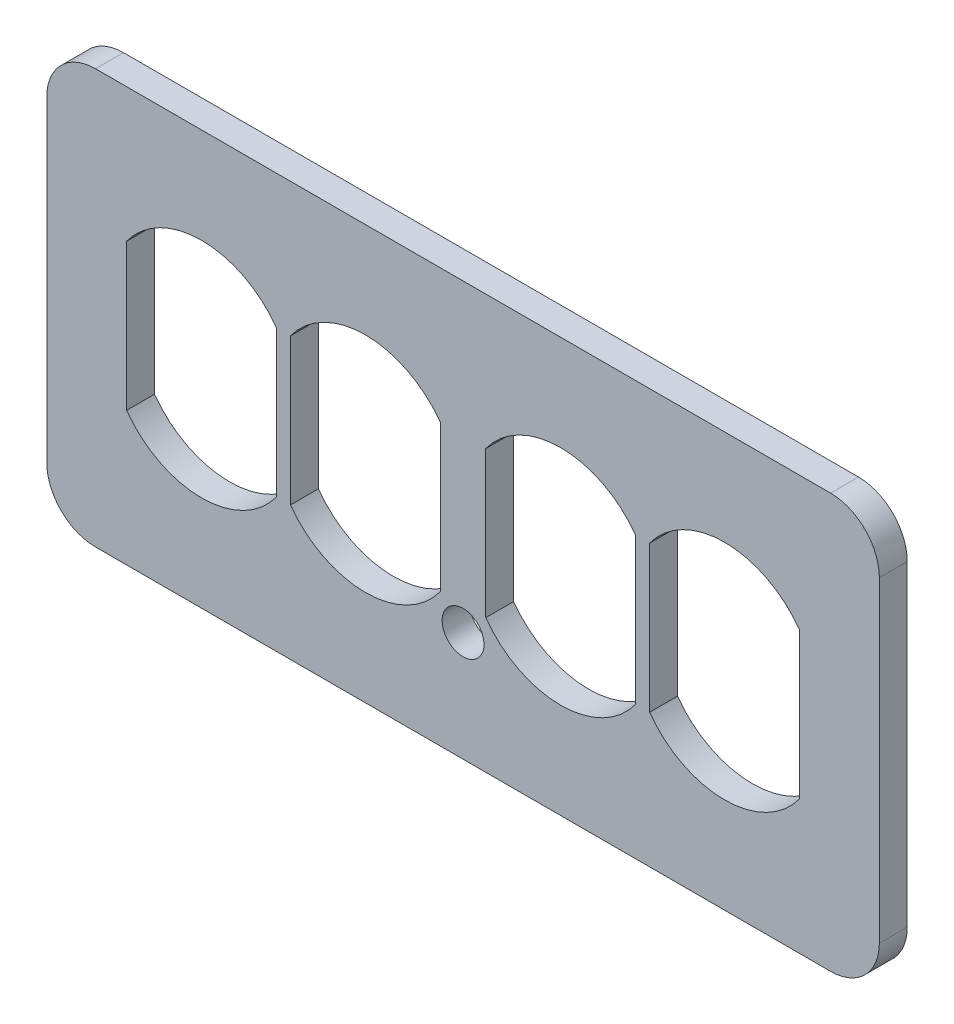
ISO-10303-21;
HEADER;
FILE_DESCRIPTION(('STEP AP214'),'2;1');
FILE_NAME('part.step','',(''),(''),'','','');
FILE_SCHEMA(('AUTOMOTIVE_DESIGN { 1 0 10303 214 1 1 1 1 }'));
ENDSEC;
DATA;
#1=APPLICATION_CONTEXT('core data for automotive mechanical design processes');
#2=APPLICATION_PROTOCOL_DEFINITION('international standard','automotive_design',2000,#1);
#3=PRODUCT_CONTEXT('',#1,'mechanical');
#4=PRODUCT('Part','Part','',(#3));
#5=PRODUCT_RELATED_PRODUCT_CATEGORY('part','',(#4));
#6=PRODUCT_DEFINITION_FORMATION('','',#4);
#7=PRODUCT_DEFINITION_CONTEXT('part definition',#1,'design');
#8=PRODUCT_DEFINITION('design','',#6,#7);
#9=PRODUCT_DEFINITION_SHAPE('','',#8);
#10=(LENGTH_UNIT() NAMED_UNIT(*) SI_UNIT(.MILLI.,.METRE.));
#11=(NAMED_UNIT(*) PLANE_ANGLE_UNIT() SI_UNIT($,.RADIAN.));
#12=(NAMED_UNIT(*) SI_UNIT($,.STERADIAN.) SOLID_ANGLE_UNIT());
#13=UNCERTAINTY_MEASURE_WITH_UNIT(LENGTH_MEASURE(1.E-05),#10,'distance_accuracy_value','');
#14=(GEOMETRIC_REPRESENTATION_CONTEXT(3) GLOBAL_UNCERTAINTY_ASSIGNED_CONTEXT((#13)) GLOBAL_UNIT_ASSIGNED_CONTEXT((#10,
#11,#12)) REPRESENTATION_CONTEXT('',''));
#15=CARTESIAN_POINT('',(0.,0.,0.));
#16=DIRECTION('',(0.,0.,1.));
#17=DIRECTION('',(1.,0.,0.));
#18=AXIS2_PLACEMENT_3D('',#15,#16,#17);
#19=CARTESIAN_POINT('',(0.,0.,4.));
#20=DIRECTION('',(0.,0.,1.));
#21=DIRECTION('',(1.,0.,0.));
#22=AXIS2_PLACEMENT_3D('',#19,#20,#21);
#23=PLANE('',#22);
#24=DIRECTION('',(0.,-1.,0.));
#25=VECTOR('',#24,1.);
#26=CARTESIAN_POINT('',(-24.75,10.5,4.));
#27=LINE('',#26,#25);
#28=CARTESIAN_POINT('',(-24.75,10.5,4.));
#29=VERTEX_POINT('',#28);
#30=CARTESIAN_POINT('',(-24.75,-10.5,4.));
#31=VERTEX_POINT('',#30);
#32=EDGE_CURVE('E210',#29,#31,#27,.T.);
#33=ORIENTED_EDGE('',*,*,#32,.F.);
#34=CARTESIAN_POINT('',(-14.,2.74431818181819,4.));
#35=DIRECTION('',(0.,0.,1.));
#36=DIRECTION('',(1.,0.,0.));
#37=AXIS2_PLACEMENT_3D('',#34,#35,#36);
#38=CIRCLE('',#37,13.2556818181818);
#39=CARTESIAN_POINT('',(-3.25,10.5,4.));
#40=VERTEX_POINT('',#39);
#41=EDGE_CURVE('E200',#40,#29,#38,.T.);
#42=ORIENTED_EDGE('',*,*,#41,.F.);
#43=DIRECTION('',(0.,1.,0.));
#44=VECTOR('',#43,1.);
#45=CARTESIAN_POINT('',(-3.25,10.5,4.));
#46=LINE('',#45,#44);
#47=CARTESIAN_POINT('',(-3.25000000000001,-10.5,4.));
#48=VERTEX_POINT('',#47);
#49=EDGE_CURVE('E226',#48,#40,#46,.T.);
#50=ORIENTED_EDGE('',*,*,#49,.F.);
#51=CARTESIAN_POINT('',(-14.,-2.74431818181819,4.));
#52=DIRECTION('',(0.,0.,1.));
#53=DIRECTION('',(-1.,0.,0.));
#54=AXIS2_PLACEMENT_3D('',#51,#52,#53);
#55=CIRCLE('',#54,13.2556818181818);
#56=EDGE_CURVE('E224',#31,#48,#55,.T.);
#57=ORIENTED_EDGE('',*,*,#56,.F.);
#58=EDGE_LOOP('',(#33,#42,#50,#57));
#59=FACE_BOUND('',#58,.T.);
#60=DIRECTION('',(0.,-1.,0.));
#61=VECTOR('',#60,1.);
#62=CARTESIAN_POINT('',(-48.25,10.5,4.));
#63=LINE('',#62,#61);
#64=CARTESIAN_POINT('',(-48.25,10.5,4.));
#65=VERTEX_POINT('',#64);
#66=CARTESIAN_POINT('',(-48.25,-10.5,4.));
#67=VERTEX_POINT('',#66);
#68=EDGE_CURVE('E246',#65,#67,#63,.T.);
#69=ORIENTED_EDGE('',*,*,#68,.F.);
#70=CARTESIAN_POINT('',(-37.5,2.74431818181819,4.));
#71=DIRECTION('',(0.,0.,1.));
#72=DIRECTION('',(1.,0.,0.));
#73=AXIS2_PLACEMENT_3D('',#70,#71,#72);
#74=CIRCLE('',#73,13.2556818181818);
#75=CARTESIAN_POINT('',(-26.75,10.5,4.));
#76=VERTEX_POINT('',#75);
#77=EDGE_CURVE('E244',#76,#65,#74,.T.);
#78=ORIENTED_EDGE('',*,*,#77,.F.);
#79=DIRECTION('',(0.,1.,0.));
#80=VECTOR('',#79,1.);
#81=CARTESIAN_POINT('',(-26.75,10.5,4.));
#82=LINE('',#81,#80);
#83=CARTESIAN_POINT('',(-26.75,-10.5,4.));
#84=VERTEX_POINT('',#83);
#85=EDGE_CURVE('E252',#84,#76,#82,.T.);
#86=ORIENTED_EDGE('',*,*,#85,.F.);
#87=CARTESIAN_POINT('',(-37.5,-2.74431818181819,4.));
#88=DIRECTION('',(0.,0.,1.));
#89=DIRECTION('',(-1.,0.,0.));
#90=AXIS2_PLACEMENT_3D('',#87,#88,#89);
#91=CIRCLE('',#90,13.2556818181818);
#92=EDGE_CURVE('E249',#67,#84,#91,.T.);
#93=ORIENTED_EDGE('',*,*,#92,.F.);
#94=EDGE_LOOP('',(#69,#78,#86,#93));
#95=FACE_BOUND('',#94,.T.);
#96=DIRECTION('',(0.,1.,0.));
#97=VECTOR('',#96,1.);
#98=CARTESIAN_POINT('',(48.25,10.5,4.));
#99=LINE('',#98,#97);
#100=CARTESIAN_POINT('',(48.25,-10.5,4.));
#101=VERTEX_POINT('',#100);
#102=CARTESIAN_POINT('',(48.25,10.5,4.));
#103=VERTEX_POINT('',#102);
#104=EDGE_CURVE('E277',#101,#103,#99,.T.);
#105=ORIENTED_EDGE('',*,*,#104,.F.);
#106=CARTESIAN_POINT('',(37.5,-2.74431818181819,4.));
#107=DIRECTION('',(0.,0.,1.));
#108=DIRECTION('',(1.,0.,0.));
#109=AXIS2_PLACEMENT_3D('',#106,#107,#108);
#110=CIRCLE('',#109,13.2556818181818);
#111=CARTESIAN_POINT('',(26.75,-10.5,4.));
#112=VERTEX_POINT('',#111);
#113=EDGE_CURVE('E275',#112,#101,#110,.T.);
#114=ORIENTED_EDGE('',*,*,#113,.F.);
#115=DIRECTION('',(0.,-1.,0.));
#116=VECTOR('',#115,1.);
#117=CARTESIAN_POINT('',(26.75,10.5,4.));
#118=LINE('',#117,#116);
#119=CARTESIAN_POINT('',(26.75,10.5,4.));
#120=VERTEX_POINT('',#119);
#121=EDGE_CURVE('E283',#120,#112,#118,.T.);
#122=ORIENTED_EDGE('',*,*,#121,.F.);
#123=CARTESIAN_POINT('',(37.5,2.74431818181819,4.));
#124=DIRECTION('',(0.,0.,1.));
#125=DIRECTION('',(-1.,0.,0.));
#126=AXIS2_PLACEMENT_3D('',#123,#124,#125);
#127=CIRCLE('',#126,13.2556818181818);
#128=EDGE_CURVE('E280',#103,#120,#127,.T.);
#129=ORIENTED_EDGE('',*,*,#128,.F.);
#130=EDGE_LOOP('',(#105,#114,#122,#129));
#131=FACE_BOUND('',#130,.T.);
#132=DIRECTION('',(0.,1.,0.));
#133=VECTOR('',#132,1.);
#134=CARTESIAN_POINT('',(24.75,10.5,4.));
#135=LINE('',#134,#133);
#136=CARTESIAN_POINT('',(24.75,-10.5,4.));
#137=VERTEX_POINT('',#136);
#138=CARTESIAN_POINT('',(24.75,10.5,4.));
#139=VERTEX_POINT('',#138);
#140=EDGE_CURVE('E308',#137,#139,#135,.T.);
#141=ORIENTED_EDGE('',*,*,#140,.F.);
#142=CARTESIAN_POINT('',(14.,-2.74431818181819,4.));
#143=DIRECTION('',(0.,0.,1.));
#144=DIRECTION('',(1.,0.,0.));
#145=AXIS2_PLACEMENT_3D('',#142,#143,#144);
#146=CIRCLE('',#145,13.2556818181818);
#147=CARTESIAN_POINT('',(3.25000000000001,-10.5,4.));
#148=VERTEX_POINT('',#147);
#149=EDGE_CURVE('E306',#148,#137,#146,.T.);
#150=ORIENTED_EDGE('',*,*,#149,.F.);
#151=DIRECTION('',(0.,-1.,0.));
#152=VECTOR('',#151,1.);
#153=CARTESIAN_POINT('',(3.25,10.5,4.));
#154=LINE('',#153,#152);
#155=CARTESIAN_POINT('',(3.25,10.5,4.));
#156=VERTEX_POINT('',#155);
#157=EDGE_CURVE('E314',#156,#148,#154,.T.);
#158=ORIENTED_EDGE('',*,*,#157,.F.);
#159=CARTESIAN_POINT('',(14.,2.74431818181819,4.));
#160=DIRECTION('',(0.,0.,1.));
#161=DIRECTION('',(-1.,0.,0.));
#162=AXIS2_PLACEMENT_3D('',#159,#160,#161);
#163=CIRCLE('',#162,13.2556818181818);
#164=EDGE_CURVE('E311',#139,#156,#163,.T.);
#165=ORIENTED_EDGE('',*,*,#164,.F.);
#166=EDGE_LOOP('',(#141,#150,#158,#165));
#167=FACE_BOUND('',#166,.T.);
#168=DIRECTION('',(0.,-1.,0.));
#169=VECTOR('',#168,1.);
#170=CARTESIAN_POINT('',(-59.7,29.7,4.));
#171=LINE('',#170,#169);
#172=CARTESIAN_POINT('',(-59.7,22.7,4.));
#173=VERTEX_POINT('',#172);
#174=CARTESIAN_POINT('',(-59.7,-22.7,4.));
#175=VERTEX_POINT('',#174);
#176=EDGE_CURVE('E342',#173,#175,#171,.T.);
#177=ORIENTED_EDGE('',*,*,#176,.T.);
#178=CARTESIAN_POINT('',(-52.7,-22.7,4.));
#179=DIRECTION('',(0.,0.,1.));
#180=DIRECTION('',(1.,0.,0.));
#181=AXIS2_PLACEMENT_3D('',#178,#179,#180);
#182=CIRCLE('',#181,7.);
#183=CARTESIAN_POINT('',(-52.7,-29.7,4.));
#184=VERTEX_POINT('',#183);
#185=EDGE_CURVE('E380',#175,#184,#182,.T.);
#186=ORIENTED_EDGE('',*,*,#185,.T.);
#187=DIRECTION('',(1.,0.,0.));
#188=VECTOR('',#187,1.);
#189=CARTESIAN_POINT('',(-59.7,-29.7,4.));
#190=LINE('',#189,#188);
#191=CARTESIAN_POINT('',(52.7,-29.7,4.));
#192=VERTEX_POINT('',#191);
#193=EDGE_CURVE('E345',#184,#192,#190,.T.);
#194=ORIENTED_EDGE('',*,*,#193,.T.);
#195=CARTESIAN_POINT('',(52.7,-22.7,4.));
#196=DIRECTION('',(0.,0.,1.));
#197=DIRECTION('',(1.,0.,0.));
#198=AXIS2_PLACEMENT_3D('',#195,#196,#197);
#199=CIRCLE('',#198,7.);
#200=CARTESIAN_POINT('',(59.7,-22.7,4.));
#201=VERTEX_POINT('',#200);
#202=EDGE_CURVE('E375',#192,#201,#199,.T.);
#203=ORIENTED_EDGE('',*,*,#202,.T.);
#204=DIRECTION('',(0.,1.,0.));
#205=VECTOR('',#204,1.);
#206=CARTESIAN_POINT('',(59.7,29.7,4.));
#207=LINE('',#206,#205);
#208=CARTESIAN_POINT('',(59.7,22.7,4.));
#209=VERTEX_POINT('',#208);
#210=EDGE_CURVE('E337',#201,#209,#207,.T.);
#211=ORIENTED_EDGE('',*,*,#210,.T.);
#212=CARTESIAN_POINT('',(52.7,22.7,4.));
#213=DIRECTION('',(0.,0.,1.));
#214=DIRECTION('',(1.,0.,0.));
#215=AXIS2_PLACEMENT_3D('',#212,#213,#214);
#216=CIRCLE('',#215,7.);
#217=CARTESIAN_POINT('',(52.7,29.7,4.));
#218=VERTEX_POINT('',#217);
#219=EDGE_CURVE('E59',#209,#218,#216,.T.);
#220=ORIENTED_EDGE('',*,*,#219,.T.);
#221=DIRECTION('',(-1.,0.,0.));
#222=VECTOR('',#221,1.);
#223=CARTESIAN_POINT('',(-59.7,29.7,4.));
#224=LINE('',#223,#222);
#225=CARTESIAN_POINT('',(-52.7,29.7,4.));
#226=VERTEX_POINT('',#225);
#227=EDGE_CURVE('E339',#218,#226,#224,.T.);
#228=ORIENTED_EDGE('',*,*,#227,.T.);
#229=CARTESIAN_POINT('',(-52.7,22.7,4.));
#230=DIRECTION('',(0.,0.,1.));
#231=DIRECTION('',(1.,0.,0.));
#232=AXIS2_PLACEMENT_3D('',#229,#230,#231);
#233=CIRCLE('',#232,7.);
#234=EDGE_CURVE('E378',#226,#173,#233,.T.);
#235=ORIENTED_EDGE('',*,*,#234,.T.);
#236=EDGE_LOOP('',(#177,#186,#194,#203,#211,#220,#228,#235));
#237=FACE_BOUND('',#236,.T.);
#238=CARTESIAN_POINT('',(0.,-13.9722154800521,4.));
#239=DIRECTION('',(0.,0.,1.));
#240=DIRECTION('',(1.,0.,0.));
#241=AXIS2_PLACEMENT_3D('',#238,#239,#240);
#242=CIRCLE('',#241,3.);
#243=CARTESIAN_POINT('',(3.,-13.9722154800521,4.));
#244=VERTEX_POINT('',#243);
#245=EDGE_CURVE('E233',#244,#244,#242,.T.);
#246=ORIENTED_EDGE('',*,*,#245,.F.);
#247=EDGE_LOOP('',(#246));
#248=FACE_BOUND('',#247,.T.);
#249=ADVANCED_FACE('F37',(#59,#95,#131,#167,#237,#248),#23,.T.);
#250=CARTESIAN_POINT('',(0.,0.,0.));
#251=DIRECTION('',(0.,0.,1.));
#252=DIRECTION('',(1.,0.,0.));
#253=AXIS2_PLACEMENT_3D('',#250,#251,#252);
#254=PLANE('',#253);
#255=CARTESIAN_POINT('',(-37.5,2.74431818181819,0.));
#256=DIRECTION('',(0.,0.,1.));
#257=DIRECTION('',(1.,0.,0.));
#258=AXIS2_PLACEMENT_3D('',#255,#256,#257);
#259=CIRCLE('',#258,13.2556818181818);
#260=CARTESIAN_POINT('',(-26.75,10.5,0.));
#261=VERTEX_POINT('',#260);
#262=CARTESIAN_POINT('',(-48.25,10.5,0.));
#263=VERTEX_POINT('',#262);
#264=EDGE_CURVE('E218',#261,#263,#259,.T.);
#265=ORIENTED_EDGE('',*,*,#264,.T.);
#266=DIRECTION('',(0.,-1.,0.));
#267=VECTOR('',#266,1.);
#268=CARTESIAN_POINT('',(-48.25,10.5,0.));
#269=LINE('',#268,#267);
#270=CARTESIAN_POINT('',(-48.25,-10.5,0.));
#271=VERTEX_POINT('',#270);
#272=EDGE_CURVE('E257',#263,#271,#269,.T.);
#273=ORIENTED_EDGE('',*,*,#272,.T.);
#274=CARTESIAN_POINT('',(-37.5,-2.74431818181819,0.));
#275=DIRECTION('',(0.,0.,1.));
#276=DIRECTION('',(-1.,0.,0.));
#277=AXIS2_PLACEMENT_3D('',#274,#275,#276);
#278=CIRCLE('',#277,13.2556818181818);
#279=CARTESIAN_POINT('',(-26.75,-10.5,0.));
#280=VERTEX_POINT('',#279);
#281=EDGE_CURVE('E260',#271,#280,#278,.T.);
#282=ORIENTED_EDGE('',*,*,#281,.T.);
#283=DIRECTION('',(0.,1.,0.));
#284=VECTOR('',#283,1.);
#285=CARTESIAN_POINT('',(-26.75,10.5,0.));
#286=LINE('',#285,#284);
#287=EDGE_CURVE('E247',#280,#261,#286,.T.);
#288=ORIENTED_EDGE('',*,*,#287,.T.);
#289=EDGE_LOOP('',(#265,#273,#282,#288));
#290=FACE_BOUND('',#289,.T.);
#291=CARTESIAN_POINT('',(14.,-2.74431818181819,0.));
#292=DIRECTION('',(0.,0.,1.));
#293=DIRECTION('',(1.,0.,0.));
#294=AXIS2_PLACEMENT_3D('',#291,#292,#293);
#295=CIRCLE('',#294,13.2556818181818);
#296=CARTESIAN_POINT('',(3.25000000000001,-10.5,0.));
#297=VERTEX_POINT('',#296);
#298=CARTESIAN_POINT('',(24.75,-10.5,0.));
#299=VERTEX_POINT('',#298);
#300=EDGE_CURVE('E305',#297,#299,#295,.T.);
#301=ORIENTED_EDGE('',*,*,#300,.T.);
#302=DIRECTION('',(0.,1.,0.));
#303=VECTOR('',#302,1.);
#304=CARTESIAN_POINT('',(24.75,10.5,0.));
#305=LINE('',#304,#303);
#306=CARTESIAN_POINT('',(24.75,10.5,0.));
#307=VERTEX_POINT('',#306);
#308=EDGE_CURVE('E319',#299,#307,#305,.T.);
#309=ORIENTED_EDGE('',*,*,#308,.T.);
#310=CARTESIAN_POINT('',(14.,2.74431818181819,0.));
#311=DIRECTION('',(0.,0.,1.));
#312=DIRECTION('',(-1.,0.,0.));
#313=AXIS2_PLACEMENT_3D('',#310,#311,#312);
#314=CIRCLE('',#313,13.2556818181818);
#315=CARTESIAN_POINT('',(3.25,10.5,0.));
#316=VERTEX_POINT('',#315);
#317=EDGE_CURVE('E322',#307,#316,#314,.T.);
#318=ORIENTED_EDGE('',*,*,#317,.T.);
#319=DIRECTION('',(0.,-1.,0.));
#320=VECTOR('',#319,1.);
#321=CARTESIAN_POINT('',(3.25,10.5,0.));
#322=LINE('',#321,#320);
#323=EDGE_CURVE('E309',#316,#297,#322,.T.);
#324=ORIENTED_EDGE('',*,*,#323,.T.);
#325=EDGE_LOOP('',(#301,#309,#318,#324));
#326=FACE_BOUND('',#325,.T.);
#327=DIRECTION('',(1.,0.,0.));
#328=VECTOR('',#327,1.);
#329=CARTESIAN_POINT('',(-59.7,-29.7,0.));
#330=LINE('',#329,#328);
#331=CARTESIAN_POINT('',(-52.7,-29.7,0.));
#332=VERTEX_POINT('',#331);
#333=CARTESIAN_POINT('',(52.7,-29.7,0.));
#334=VERTEX_POINT('',#333);
#335=EDGE_CURVE('E340',#332,#334,#330,.T.);
#336=ORIENTED_EDGE('',*,*,#335,.F.);
#337=CARTESIAN_POINT('',(-52.7,-22.7,0.));
#338=DIRECTION('',(0.,0.,1.));
#339=DIRECTION('',(1.,0.,0.));
#340=AXIS2_PLACEMENT_3D('',#337,#338,#339);
#341=CIRCLE('',#340,7.);
#342=CARTESIAN_POINT('',(-59.7,-22.7,0.));
#343=VERTEX_POINT('',#342);
#344=EDGE_CURVE('E368',#332,#343,#341,.F.);
#345=ORIENTED_EDGE('',*,*,#344,.T.);
#346=DIRECTION('',(0.,-1.,0.));
#347=VECTOR('',#346,1.);
#348=CARTESIAN_POINT('',(-59.7,29.7,0.));
#349=LINE('',#348,#347);
#350=CARTESIAN_POINT('',(-59.7,22.7,0.));
#351=VERTEX_POINT('',#350);
#352=EDGE_CURVE('E353',#351,#343,#349,.T.);
#353=ORIENTED_EDGE('',*,*,#352,.F.);
#354=CARTESIAN_POINT('',(-52.7,22.7,0.));
#355=DIRECTION('',(0.,0.,1.));
#356=DIRECTION('',(1.,0.,0.));
#357=AXIS2_PLACEMENT_3D('',#354,#355,#356);
#358=CIRCLE('',#357,7.);
#359=CARTESIAN_POINT('',(-52.7,29.7,0.));
#360=VERTEX_POINT('',#359);
#361=EDGE_CURVE('E366',#351,#360,#358,.F.);
#362=ORIENTED_EDGE('',*,*,#361,.T.);
#363=DIRECTION('',(-1.,0.,0.));
#364=VECTOR('',#363,1.);
#365=CARTESIAN_POINT('',(-59.7,29.7,0.));
#366=LINE('',#365,#364);
#367=CARTESIAN_POINT('',(52.7,29.7,0.));
#368=VERTEX_POINT('',#367);
#369=EDGE_CURVE('E351',#368,#360,#366,.T.);
#370=ORIENTED_EDGE('',*,*,#369,.F.);
#371=CARTESIAN_POINT('',(52.7,22.7,0.));
#372=DIRECTION('',(0.,0.,1.));
#373=DIRECTION('',(1.,0.,0.));
#374=AXIS2_PLACEMENT_3D('',#371,#372,#373);
#375=CIRCLE('',#374,7.);
#376=CARTESIAN_POINT('',(59.7,22.7,0.));
#377=VERTEX_POINT('',#376);
#378=EDGE_CURVE('E364',#368,#377,#375,.F.);
#379=ORIENTED_EDGE('',*,*,#378,.T.);
#380=DIRECTION('',(0.,1.,0.));
#381=VECTOR('',#380,1.);
#382=CARTESIAN_POINT('',(59.7,29.7,0.));
#383=LINE('',#382,#381);
#384=CARTESIAN_POINT('',(59.7,-22.7,0.));
#385=VERTEX_POINT('',#384);
#386=EDGE_CURVE('E336',#385,#377,#383,.T.);
#387=ORIENTED_EDGE('',*,*,#386,.F.);
#388=CARTESIAN_POINT('',(52.7,-22.7,0.));
#389=DIRECTION('',(0.,0.,1.));
#390=DIRECTION('',(1.,0.,0.));
#391=AXIS2_PLACEMENT_3D('',#388,#389,#390);
#392=CIRCLE('',#391,7.);
#393=EDGE_CURVE('E362',#385,#334,#392,.F.);
#394=ORIENTED_EDGE('',*,*,#393,.T.);
#395=EDGE_LOOP('',(#336,#345,#353,#362,#370,#379,#387,#394));
#396=FACE_BOUND('',#395,.T.);
#397=CARTESIAN_POINT('',(37.5,-2.74431818181819,0.));
#398=DIRECTION('',(0.,0.,1.));
#399=DIRECTION('',(1.,0.,0.));
#400=AXIS2_PLACEMENT_3D('',#397,#398,#399);
#401=CIRCLE('',#400,13.2556818181818);
#402=CARTESIAN_POINT('',(26.75,-10.5,0.));
#403=VERTEX_POINT('',#402);
#404=CARTESIAN_POINT('',(48.25,-10.5,0.));
#405=VERTEX_POINT('',#404);
#406=EDGE_CURVE('E274',#403,#405,#401,.T.);
#407=ORIENTED_EDGE('',*,*,#406,.T.);
#408=DIRECTION('',(0.,1.,0.));
#409=VECTOR('',#408,1.);
#410=CARTESIAN_POINT('',(48.25,10.5,0.));
#411=LINE('',#410,#409);
#412=CARTESIAN_POINT('',(48.25,10.5,0.));
#413=VERTEX_POINT('',#412);
#414=EDGE_CURVE('E288',#405,#413,#411,.T.);
#415=ORIENTED_EDGE('',*,*,#414,.T.);
#416=CARTESIAN_POINT('',(37.5,2.74431818181819,0.));
#417=DIRECTION('',(0.,0.,1.));
#418=DIRECTION('',(-1.,0.,0.));
#419=AXIS2_PLACEMENT_3D('',#416,#417,#418);
#420=CIRCLE('',#419,13.2556818181818);
#421=CARTESIAN_POINT('',(26.75,10.5,0.));
#422=VERTEX_POINT('',#421);
#423=EDGE_CURVE('E291',#413,#422,#420,.T.);
#424=ORIENTED_EDGE('',*,*,#423,.T.);
#425=DIRECTION('',(0.,-1.,0.));
#426=VECTOR('',#425,1.);
#427=CARTESIAN_POINT('',(26.75,10.5,0.));
#428=LINE('',#427,#426);
#429=EDGE_CURVE('E278',#422,#403,#428,.T.);
#430=ORIENTED_EDGE('',*,*,#429,.T.);
#431=EDGE_LOOP('',(#407,#415,#424,#430));
#432=FACE_BOUND('',#431,.T.);
#433=CARTESIAN_POINT('',(-14.,2.74431818181819,0.));
#434=DIRECTION('',(0.,0.,1.));
#435=DIRECTION('',(1.,0.,0.));
#436=AXIS2_PLACEMENT_3D('',#433,#434,#435);
#437=CIRCLE('',#436,13.2556818181818);
#438=CARTESIAN_POINT('',(-3.25,10.5,0.));
#439=VERTEX_POINT('',#438);
#440=CARTESIAN_POINT('',(-24.75,10.5,0.));
#441=VERTEX_POINT('',#440);
#442=EDGE_CURVE('E231',#439,#441,#437,.T.);
#443=ORIENTED_EDGE('',*,*,#442,.T.);
#444=DIRECTION('',(0.,-1.,0.));
#445=VECTOR('',#444,1.);
#446=CARTESIAN_POINT('',(-24.75,10.5,0.));
#447=LINE('',#446,#445);
#448=CARTESIAN_POINT('',(-24.75,-10.5,0.));
#449=VERTEX_POINT('',#448);
#450=EDGE_CURVE('E217',#441,#449,#447,.T.);
#451=ORIENTED_EDGE('',*,*,#450,.T.);
#452=CARTESIAN_POINT('',(-14.,-2.74431818181819,0.));
#453=DIRECTION('',(0.,0.,1.));
#454=DIRECTION('',(-1.,0.,0.));
#455=AXIS2_PLACEMENT_3D('',#452,#453,#454);
#456=CIRCLE('',#455,13.2556818181818);
#457=CARTESIAN_POINT('',(-3.25000000000001,-10.5,0.));
#458=VERTEX_POINT('',#457);
#459=EDGE_CURVE('E235',#449,#458,#456,.T.);
#460=ORIENTED_EDGE('',*,*,#459,.T.);
#461=DIRECTION('',(0.,1.,0.));
#462=VECTOR('',#461,1.);
#463=CARTESIAN_POINT('',(-3.25,10.5,0.));
#464=LINE('',#463,#462);
#465=EDGE_CURVE('E211',#458,#439,#464,.T.);
#466=ORIENTED_EDGE('',*,*,#465,.T.);
#467=EDGE_LOOP('',(#443,#451,#460,#466));
#468=FACE_BOUND('',#467,.T.);
#469=CARTESIAN_POINT('',(0.,-13.9722154800521,0.));
#470=DIRECTION('',(0.,0.,1.));
#471=DIRECTION('',(1.,0.,0.));
#472=AXIS2_PLACEMENT_3D('',#469,#470,#471);
#473=CIRCLE('',#472,3.);
#474=CARTESIAN_POINT('',(3.,-13.9722154800521,0.));
#475=VERTEX_POINT('',#474);
#476=EDGE_CURVE('E691',#475,#475,#473,.T.);
#477=ORIENTED_EDGE('',*,*,#476,.T.);
#478=EDGE_LOOP('',(#477));
#479=FACE_BOUND('',#478,.T.);
#480=ADVANCED_FACE('F396',(#290,#326,#396,#432,#468,#479),#254,.F.);
#481=CARTESIAN_POINT('',(59.7,29.7,4.));
#482=DIRECTION('',(-1.,0.,0.));
#483=DIRECTION('',(0.,0.,1.));
#484=AXIS2_PLACEMENT_3D('',#481,#482,#483);
#485=PLANE('',#484);
#486=ORIENTED_EDGE('',*,*,#386,.T.);
#487=DIRECTION('',(0.,0.,-1.));
#488=VECTOR('',#487,1.);
#489=CARTESIAN_POINT('',(59.7,22.7,4.));
#490=LINE('',#489,#488);
#491=EDGE_CURVE('E11',#377,#209,#490,.F.);
#492=ORIENTED_EDGE('',*,*,#491,.T.);
#493=ORIENTED_EDGE('',*,*,#210,.F.);
#494=DIRECTION('',(0.,0.,-1.));
#495=VECTOR('',#494,1.);
#496=CARTESIAN_POINT('',(59.7,-22.7,4.));
#497=LINE('',#496,#495);
#498=EDGE_CURVE('E45',#201,#385,#497,.T.);
#499=ORIENTED_EDGE('',*,*,#498,.T.);
#500=EDGE_LOOP('',(#486,#492,#493,#499));
#501=FACE_BOUND('',#500,.T.);
#502=ADVANCED_FACE('F390',(#501),#485,.F.);
#503=CARTESIAN_POINT('',(-59.7,29.7,4.));
#504=DIRECTION('',(0.,-1.,0.));
#505=DIRECTION('',(0.,0.,-1.));
#506=AXIS2_PLACEMENT_3D('',#503,#504,#505);
#507=PLANE('',#506);
#508=ORIENTED_EDGE('',*,*,#369,.T.);
#509=DIRECTION('',(0.,0.,-1.));
#510=VECTOR('',#509,1.);
#511=CARTESIAN_POINT('',(-52.7,29.7,4.));
#512=LINE('',#511,#510);
#513=EDGE_CURVE('E52',#360,#226,#512,.F.);
#514=ORIENTED_EDGE('',*,*,#513,.T.);
#515=ORIENTED_EDGE('',*,*,#227,.F.);
#516=DIRECTION('',(0.,0.,-1.));
#517=VECTOR('',#516,1.);
#518=CARTESIAN_POINT('',(52.7,29.7,4.));
#519=LINE('',#518,#517);
#520=EDGE_CURVE('E382',#218,#368,#519,.T.);
#521=ORIENTED_EDGE('',*,*,#520,.T.);
#522=EDGE_LOOP('',(#508,#514,#515,#521));
#523=FACE_BOUND('',#522,.T.);
#524=ADVANCED_FACE('F402',(#523),#507,.F.);
#525=CARTESIAN_POINT('',(-59.7,29.7,4.));
#526=DIRECTION('',(1.,0.,0.));
#527=DIRECTION('',(0.,0.,-1.));
#528=AXIS2_PLACEMENT_3D('',#525,#526,#527);
#529=PLANE('',#528);
#530=ORIENTED_EDGE('',*,*,#352,.T.);
#531=DIRECTION('',(0.,0.,-1.));
#532=VECTOR('',#531,1.);
#533=CARTESIAN_POINT('',(-59.7,-22.7,4.));
#534=LINE('',#533,#532);
#535=EDGE_CURVE('E373',#343,#175,#534,.F.);
#536=ORIENTED_EDGE('',*,*,#535,.T.);
#537=ORIENTED_EDGE('',*,*,#176,.F.);
#538=DIRECTION('',(0.,0.,-1.));
#539=VECTOR('',#538,1.);
#540=CARTESIAN_POINT('',(-59.7,22.7,4.));
#541=LINE('',#540,#539);
#542=EDGE_CURVE('E370',#173,#351,#541,.T.);
#543=ORIENTED_EDGE('',*,*,#542,.T.);
#544=EDGE_LOOP('',(#530,#536,#537,#543));
#545=FACE_BOUND('',#544,.T.);
#546=ADVANCED_FACE('F411',(#545),#529,.F.);
#547=CARTESIAN_POINT('',(-59.7,-29.7,4.));
#548=DIRECTION('',(0.,1.,0.));
#549=DIRECTION('',(0.,0.,1.));
#550=AXIS2_PLACEMENT_3D('',#547,#548,#549);
#551=PLANE('',#550);
#552=ORIENTED_EDGE('',*,*,#193,.F.);
#553=DIRECTION('',(0.,0.,-1.));
#554=VECTOR('',#553,1.);
#555=CARTESIAN_POINT('',(-52.7,-29.7,4.));
#556=LINE('',#555,#554);
#557=EDGE_CURVE('E359',#184,#332,#556,.T.);
#558=ORIENTED_EDGE('',*,*,#557,.T.);
#559=ORIENTED_EDGE('',*,*,#335,.T.);
#560=DIRECTION('',(0.,0.,-1.));
#561=VECTOR('',#560,1.);
#562=CARTESIAN_POINT('',(52.7,-29.7,4.));
#563=LINE('',#562,#561);
#564=EDGE_CURVE('E348',#334,#192,#563,.F.);
#565=ORIENTED_EDGE('',*,*,#564,.T.);
#566=EDGE_LOOP('',(#552,#558,#559,#565));
#567=FACE_BOUND('',#566,.T.);
#568=ADVANCED_FACE('F419',(#567),#551,.F.);
#569=CARTESIAN_POINT('',(14.,-2.74431818181819,4.));
#570=DIRECTION('',(0.,0.,-1.));
#571=DIRECTION('',(-1.,0.,0.));
#572=AXIS2_PLACEMENT_3D('',#569,#570,#571);
#573=CYLINDRICAL_SURFACE('',#572,13.2556818181818);
#574=ORIENTED_EDGE('',*,*,#300,.F.);
#575=DIRECTION('',(0.,0.,-1.));
#576=VECTOR('',#575,1.);
#577=CARTESIAN_POINT('',(3.25000000000001,-10.5,4.));
#578=LINE('',#577,#576);
#579=EDGE_CURVE('E316',#148,#297,#578,.T.);
#580=ORIENTED_EDGE('',*,*,#579,.F.);
#581=ORIENTED_EDGE('',*,*,#149,.T.);
#582=DIRECTION('',(0.,0.,-1.));
#583=VECTOR('',#582,1.);
#584=CARTESIAN_POINT('',(24.75,-10.5,4.));
#585=LINE('',#584,#583);
#586=EDGE_CURVE('E333',#137,#299,#585,.T.);
#587=ORIENTED_EDGE('',*,*,#586,.T.);
#588=EDGE_LOOP('',(#574,#580,#581,#587));
#589=FACE_BOUND('',#588,.T.);
#590=ADVANCED_FACE('F433',(#589),#573,.F.);
#591=CARTESIAN_POINT('',(24.75,10.5,4.));
#592=DIRECTION('',(-1.,0.,0.));
#593=DIRECTION('',(0.,0.,1.));
#594=AXIS2_PLACEMENT_3D('',#591,#592,#593);
#595=PLANE('',#594);
#596=ORIENTED_EDGE('',*,*,#308,.F.);
#597=ORIENTED_EDGE('',*,*,#586,.F.);
#598=ORIENTED_EDGE('',*,*,#140,.T.);
#599=DIRECTION('',(0.,0.,-1.));
#600=VECTOR('',#599,1.);
#601=CARTESIAN_POINT('',(24.75,10.5,4.));
#602=LINE('',#601,#600);
#603=EDGE_CURVE('E331',#139,#307,#602,.T.);
#604=ORIENTED_EDGE('',*,*,#603,.T.);
#605=EDGE_LOOP('',(#596,#597,#598,#604));
#606=FACE_BOUND('',#605,.T.);
#607=ADVANCED_FACE('F599',(#606),#595,.T.);
#608=CARTESIAN_POINT('',(14.,2.74431818181819,4.));
#609=DIRECTION('',(0.,0.,-1.));
#610=DIRECTION('',(-1.,0.,0.));
#611=AXIS2_PLACEMENT_3D('',#608,#609,#610);
#612=CYLINDRICAL_SURFACE('',#611,13.2556818181818);
#613=ORIENTED_EDGE('',*,*,#317,.F.);
#614=ORIENTED_EDGE('',*,*,#603,.F.);
#615=ORIENTED_EDGE('',*,*,#164,.T.);
#616=DIRECTION('',(0.,0.,-1.));
#617=VECTOR('',#616,1.);
#618=CARTESIAN_POINT('',(3.25,10.5,4.));
#619=LINE('',#618,#617);
#620=EDGE_CURVE('E329',#156,#316,#619,.T.);
#621=ORIENTED_EDGE('',*,*,#620,.T.);
#622=EDGE_LOOP('',(#613,#614,#615,#621));
#623=FACE_BOUND('',#622,.T.);
#624=ADVANCED_FACE('F590',(#623),#612,.F.);
#625=CARTESIAN_POINT('',(3.25,10.5,4.));
#626=DIRECTION('',(1.,0.,0.));
#627=DIRECTION('',(0.,1.,0.));
#628=AXIS2_PLACEMENT_3D('',#625,#626,#627);
#629=PLANE('',#628);
#630=ORIENTED_EDGE('',*,*,#323,.F.);
#631=ORIENTED_EDGE('',*,*,#620,.F.);
#632=ORIENTED_EDGE('',*,*,#157,.T.);
#633=ORIENTED_EDGE('',*,*,#579,.T.);
#634=EDGE_LOOP('',(#630,#631,#632,#633));
#635=FACE_BOUND('',#634,.T.);
#636=ADVANCED_FACE('F581',(#635),#629,.T.);
#637=CARTESIAN_POINT('',(37.5,-2.74431818181819,4.));
#638=DIRECTION('',(0.,0.,-1.));
#639=DIRECTION('',(-1.,0.,0.));
#640=AXIS2_PLACEMENT_3D('',#637,#638,#639);
#641=CYLINDRICAL_SURFACE('',#640,13.2556818181818);
#642=ORIENTED_EDGE('',*,*,#406,.F.);
#643=DIRECTION('',(0.,0.,-1.));
#644=VECTOR('',#643,1.);
#645=CARTESIAN_POINT('',(26.75,-10.5,4.));
#646=LINE('',#645,#644);
#647=EDGE_CURVE('E285',#112,#403,#646,.T.);
#648=ORIENTED_EDGE('',*,*,#647,.F.);
#649=ORIENTED_EDGE('',*,*,#113,.T.);
#650=DIRECTION('',(0.,0.,-1.));
#651=VECTOR('',#650,1.);
#652=CARTESIAN_POINT('',(48.25,-10.5,4.));
#653=LINE('',#652,#651);
#654=EDGE_CURVE('E302',#101,#405,#653,.T.);
#655=ORIENTED_EDGE('',*,*,#654,.T.);
#656=EDGE_LOOP('',(#642,#648,#649,#655));
#657=FACE_BOUND('',#656,.T.);
#658=ADVANCED_FACE('F572',(#657),#641,.F.);
#659=CARTESIAN_POINT('',(48.25,10.5,4.));
#660=DIRECTION('',(-1.,0.,0.));
#661=DIRECTION('',(0.,0.,1.));
#662=AXIS2_PLACEMENT_3D('',#659,#660,#661);
#663=PLANE('',#662);
#664=ORIENTED_EDGE('',*,*,#414,.F.);
#665=ORIENTED_EDGE('',*,*,#654,.F.);
#666=ORIENTED_EDGE('',*,*,#104,.T.);
#667=DIRECTION('',(0.,0.,-1.));
#668=VECTOR('',#667,1.);
#669=CARTESIAN_POINT('',(48.25,10.5,4.));
#670=LINE('',#669,#668);
#671=EDGE_CURVE('E300',#103,#413,#670,.T.);
#672=ORIENTED_EDGE('',*,*,#671,.T.);
#673=EDGE_LOOP('',(#664,#665,#666,#672));
#674=FACE_BOUND('',#673,.T.);
#675=ADVANCED_FACE('F563',(#674),#663,.T.);
#676=CARTESIAN_POINT('',(37.5,2.74431818181819,4.));
#677=DIRECTION('',(0.,0.,-1.));
#678=DIRECTION('',(-1.,0.,0.));
#679=AXIS2_PLACEMENT_3D('',#676,#677,#678);
#680=CYLINDRICAL_SURFACE('',#679,13.2556818181818);
#681=ORIENTED_EDGE('',*,*,#423,.F.);
#682=ORIENTED_EDGE('',*,*,#671,.F.);
#683=ORIENTED_EDGE('',*,*,#128,.T.);
#684=DIRECTION('',(0.,0.,-1.));
#685=VECTOR('',#684,1.);
#686=CARTESIAN_POINT('',(26.75,10.5,4.));
#687=LINE('',#686,#685);
#688=EDGE_CURVE('E298',#120,#422,#687,.T.);
#689=ORIENTED_EDGE('',*,*,#688,.T.);
#690=EDGE_LOOP('',(#681,#682,#683,#689));
#691=FACE_BOUND('',#690,.T.);
#692=ADVANCED_FACE('F554',(#691),#680,.F.);
#693=CARTESIAN_POINT('',(26.75,10.5,4.));
#694=DIRECTION('',(1.,0.,0.));
#695=DIRECTION('',(0.,1.,0.));
#696=AXIS2_PLACEMENT_3D('',#693,#694,#695);
#697=PLANE('',#696);
#698=ORIENTED_EDGE('',*,*,#429,.F.);
#699=ORIENTED_EDGE('',*,*,#688,.F.);
#700=ORIENTED_EDGE('',*,*,#121,.T.);
#701=ORIENTED_EDGE('',*,*,#647,.T.);
#702=EDGE_LOOP('',(#698,#699,#700,#701));
#703=FACE_BOUND('',#702,.T.);
#704=ADVANCED_FACE('F545',(#703),#697,.T.);
#705=CARTESIAN_POINT('',(-37.5,2.74431818181819,4.));
#706=DIRECTION('',(0.,0.,-1.));
#707=DIRECTION('',(-1.,0.,0.));
#708=AXIS2_PLACEMENT_3D('',#705,#706,#707);
#709=CYLINDRICAL_SURFACE('',#708,13.2556818181818);
#710=ORIENTED_EDGE('',*,*,#264,.F.);
#711=DIRECTION('',(0.,0.,-1.));
#712=VECTOR('',#711,1.);
#713=CARTESIAN_POINT('',(-26.75,10.5,4.));
#714=LINE('',#713,#712);
#715=EDGE_CURVE('E254',#76,#261,#714,.T.);
#716=ORIENTED_EDGE('',*,*,#715,.F.);
#717=ORIENTED_EDGE('',*,*,#77,.T.);
#718=DIRECTION('',(0.,0.,-1.));
#719=VECTOR('',#718,1.);
#720=CARTESIAN_POINT('',(-48.25,10.5,4.));
#721=LINE('',#720,#719);
#722=EDGE_CURVE('E271',#65,#263,#721,.T.);
#723=ORIENTED_EDGE('',*,*,#722,.T.);
#724=EDGE_LOOP('',(#710,#716,#717,#723));
#725=FACE_BOUND('',#724,.T.);
#726=ADVANCED_FACE('F536',(#725),#709,.F.);
#727=CARTESIAN_POINT('',(-48.25,10.5,4.));
#728=DIRECTION('',(1.,0.,0.));
#729=DIRECTION('',(0.,0.,-1.));
#730=AXIS2_PLACEMENT_3D('',#727,#728,#729);
#731=PLANE('',#730);
#732=ORIENTED_EDGE('',*,*,#272,.F.);
#733=ORIENTED_EDGE('',*,*,#722,.F.);
#734=ORIENTED_EDGE('',*,*,#68,.T.);
#735=DIRECTION('',(0.,0.,-1.));
#736=VECTOR('',#735,1.);
#737=CARTESIAN_POINT('',(-48.25,-10.5,4.));
#738=LINE('',#737,#736);
#739=EDGE_CURVE('E269',#67,#271,#738,.T.);
#740=ORIENTED_EDGE('',*,*,#739,.T.);
#741=EDGE_LOOP('',(#732,#733,#734,#740));
#742=FACE_BOUND('',#741,.T.);
#743=ADVANCED_FACE('F527',(#742),#731,.T.);
#744=CARTESIAN_POINT('',(-37.5,-2.74431818181819,4.));
#745=DIRECTION('',(0.,0.,-1.));
#746=DIRECTION('',(-1.,0.,0.));
#747=AXIS2_PLACEMENT_3D('',#744,#745,#746);
#748=CYLINDRICAL_SURFACE('',#747,13.2556818181818);
#749=ORIENTED_EDGE('',*,*,#281,.F.);
#750=ORIENTED_EDGE('',*,*,#739,.F.);
#751=ORIENTED_EDGE('',*,*,#92,.T.);
#752=DIRECTION('',(0.,0.,-1.));
#753=VECTOR('',#752,1.);
#754=CARTESIAN_POINT('',(-26.75,-10.5,4.));
#755=LINE('',#754,#753);
#756=EDGE_CURVE('E267',#84,#280,#755,.T.);
#757=ORIENTED_EDGE('',*,*,#756,.T.);
#758=EDGE_LOOP('',(#749,#750,#751,#757));
#759=FACE_BOUND('',#758,.T.);
#760=ADVANCED_FACE('F518',(#759),#748,.F.);
#761=CARTESIAN_POINT('',(-26.75,10.5,4.));
#762=DIRECTION('',(-1.,0.,0.));
#763=DIRECTION('',(0.,-1.,0.));
#764=AXIS2_PLACEMENT_3D('',#761,#762,#763);
#765=PLANE('',#764);
#766=ORIENTED_EDGE('',*,*,#287,.F.);
#767=ORIENTED_EDGE('',*,*,#756,.F.);
#768=ORIENTED_EDGE('',*,*,#85,.T.);
#769=ORIENTED_EDGE('',*,*,#715,.T.);
#770=EDGE_LOOP('',(#766,#767,#768,#769));
#771=FACE_BOUND('',#770,.T.);
#772=ADVANCED_FACE('F510',(#771),#765,.T.);
#773=CARTESIAN_POINT('',(-14.,2.74431818181819,4.));
#774=DIRECTION('',(0.,0.,-1.));
#775=DIRECTION('',(-1.,0.,0.));
#776=AXIS2_PLACEMENT_3D('',#773,#774,#775);
#777=CYLINDRICAL_SURFACE('',#776,13.2556818181818);
#778=ORIENTED_EDGE('',*,*,#442,.F.);
#779=DIRECTION('',(0.,0.,-1.));
#780=VECTOR('',#779,1.);
#781=CARTESIAN_POINT('',(-3.25,10.5,4.));
#782=LINE('',#781,#780);
#783=EDGE_CURVE('E206',#40,#439,#782,.T.);
#784=ORIENTED_EDGE('',*,*,#783,.F.);
#785=ORIENTED_EDGE('',*,*,#41,.T.);
#786=DIRECTION('',(0.,0.,-1.));
#787=VECTOR('',#786,1.);
#788=CARTESIAN_POINT('',(-24.75,10.5,4.));
#789=LINE('',#788,#787);
#790=EDGE_CURVE('E203',#29,#441,#789,.T.);
#791=ORIENTED_EDGE('',*,*,#790,.T.);
#792=EDGE_LOOP('',(#778,#784,#785,#791));
#793=FACE_BOUND('',#792,.T.);
#794=ADVANCED_FACE('F202',(#793),#777,.F.);
#795=CARTESIAN_POINT('',(-24.75,10.5,4.));
#796=DIRECTION('',(1.,0.,0.));
#797=DIRECTION('',(0.,0.,-1.));
#798=AXIS2_PLACEMENT_3D('',#795,#796,#797);
#799=PLANE('',#798);
#800=ORIENTED_EDGE('',*,*,#450,.F.);
#801=ORIENTED_EDGE('',*,*,#790,.F.);
#802=ORIENTED_EDGE('',*,*,#32,.T.);
#803=DIRECTION('',(0.,0.,-1.));
#804=VECTOR('',#803,1.);
#805=CARTESIAN_POINT('',(-24.75,-10.5,4.));
#806=LINE('',#805,#804);
#807=EDGE_CURVE('E219',#31,#449,#806,.T.);
#808=ORIENTED_EDGE('',*,*,#807,.T.);
#809=EDGE_LOOP('',(#800,#801,#802,#808));
#810=FACE_BOUND('',#809,.T.);
#811=ADVANCED_FACE('F214',(#810),#799,.T.);
#812=CARTESIAN_POINT('',(-14.,-2.74431818181819,4.));
#813=DIRECTION('',(0.,0.,-1.));
#814=DIRECTION('',(-1.,0.,0.));
#815=AXIS2_PLACEMENT_3D('',#812,#813,#814);
#816=CYLINDRICAL_SURFACE('',#815,13.2556818181818);
#817=ORIENTED_EDGE('',*,*,#459,.F.);
#818=ORIENTED_EDGE('',*,*,#807,.F.);
#819=ORIENTED_EDGE('',*,*,#56,.T.);
#820=DIRECTION('',(0.,0.,-1.));
#821=VECTOR('',#820,1.);
#822=CARTESIAN_POINT('',(-3.25000000000001,-10.5,4.));
#823=LINE('',#822,#821);
#824=EDGE_CURVE('E241',#48,#458,#823,.T.);
#825=ORIENTED_EDGE('',*,*,#824,.T.);
#826=EDGE_LOOP('',(#817,#818,#819,#825));
#827=FACE_BOUND('',#826,.T.);
#828=ADVANCED_FACE('F486',(#827),#816,.F.);
#829=CARTESIAN_POINT('',(-3.25,10.5,4.));
#830=DIRECTION('',(-1.,0.,0.));
#831=DIRECTION('',(0.,-1.,0.));
#832=AXIS2_PLACEMENT_3D('',#829,#830,#831);
#833=PLANE('',#832);
#834=ORIENTED_EDGE('',*,*,#465,.F.);
#835=ORIENTED_EDGE('',*,*,#824,.F.);
#836=ORIENTED_EDGE('',*,*,#49,.T.);
#837=ORIENTED_EDGE('',*,*,#783,.T.);
#838=EDGE_LOOP('',(#834,#835,#836,#837));
#839=FACE_BOUND('',#838,.T.);
#840=ADVANCED_FACE('F477',(#839),#833,.T.);
#841=CARTESIAN_POINT('',(0.,-13.9722154800521,4.));
#842=DIRECTION('',(0.,0.,-1.));
#843=DIRECTION('',(-1.,0.,0.));
#844=AXIS2_PLACEMENT_3D('',#841,#842,#843);
#845=CYLINDRICAL_SURFACE('',#844,3.);
#846=ORIENTED_EDGE('',*,*,#245,.T.);
#847=EDGE_LOOP('',(#846));
#848=FACE_BOUND('',#847,.T.);
#849=ORIENTED_EDGE('',*,*,#476,.F.);
#850=EDGE_LOOP('',(#849));
#851=FACE_BOUND('',#850,.T.);
#852=ADVANCED_FACE('F446',(#848,#851),#845,.F.);
#853=CARTESIAN_POINT('',(-52.7,-22.7,4.));
#854=DIRECTION('',(0.,0.,-1.));
#855=DIRECTION('',(-1.,0.,0.));
#856=AXIS2_PLACEMENT_3D('',#853,#854,#855);
#857=CYLINDRICAL_SURFACE('',#856,7.);
#858=ORIENTED_EDGE('',*,*,#185,.F.);
#859=ORIENTED_EDGE('',*,*,#535,.F.);
#860=ORIENTED_EDGE('',*,*,#344,.F.);
#861=ORIENTED_EDGE('',*,*,#557,.F.);
#862=EDGE_LOOP('',(#858,#859,#860,#861));
#863=FACE_BOUND('',#862,.T.);
#864=ADVANCED_FACE('F416',(#863),#857,.T.);
#865=CARTESIAN_POINT('',(-52.7,22.7,4.));
#866=DIRECTION('',(0.,0.,-1.));
#867=DIRECTION('',(-1.,0.,0.));
#868=AXIS2_PLACEMENT_3D('',#865,#866,#867);
#869=CYLINDRICAL_SURFACE('',#868,7.);
#870=ORIENTED_EDGE('',*,*,#234,.F.);
#871=ORIENTED_EDGE('',*,*,#513,.F.);
#872=ORIENTED_EDGE('',*,*,#361,.F.);
#873=ORIENTED_EDGE('',*,*,#542,.F.);
#874=EDGE_LOOP('',(#870,#871,#872,#873));
#875=FACE_BOUND('',#874,.T.);
#876=ADVANCED_FACE('F408',(#875),#869,.T.);
#877=CARTESIAN_POINT('',(52.7,22.7,4.));
#878=DIRECTION('',(0.,0.,-1.));
#879=DIRECTION('',(-1.,0.,0.));
#880=AXIS2_PLACEMENT_3D('',#877,#878,#879);
#881=CYLINDRICAL_SURFACE('',#880,7.);
#882=ORIENTED_EDGE('',*,*,#219,.F.);
#883=ORIENTED_EDGE('',*,*,#491,.F.);
#884=ORIENTED_EDGE('',*,*,#378,.F.);
#885=ORIENTED_EDGE('',*,*,#520,.F.);
#886=EDGE_LOOP('',(#882,#883,#884,#885));
#887=FACE_BOUND('',#886,.T.);
#888=ADVANCED_FACE('F401',(#887),#881,.T.);
#889=CARTESIAN_POINT('',(52.7,-22.7,4.));
#890=DIRECTION('',(0.,0.,-1.));
#891=DIRECTION('',(-1.,0.,0.));
#892=AXIS2_PLACEMENT_3D('',#889,#890,#891);
#893=CYLINDRICAL_SURFACE('',#892,7.);
#894=ORIENTED_EDGE('',*,*,#202,.F.);
#895=ORIENTED_EDGE('',*,*,#564,.F.);
#896=ORIENTED_EDGE('',*,*,#393,.F.);
#897=ORIENTED_EDGE('',*,*,#498,.F.);
#898=EDGE_LOOP('',(#894,#895,#896,#897));
#899=FACE_BOUND('',#898,.T.);
#900=ADVANCED_FACE('F39',(#899),#893,.T.);
#901=CLOSED_SHELL('',(#249,#480,#502,#524,#546,#568,#590,#607,#624,#636,#658,#675,#692,#704,
#726,#743,#760,#772,#794,#811,#828,#840,#852,#864,#876,#888,#900));
#902=MANIFOLD_SOLID_BREP('B2',#901);
#903=ADVANCED_BREP_SHAPE_REPRESENTATION('',(#18,#902),#14);
#904=SHAPE_DEFINITION_REPRESENTATION(#9,#903);
ENDSEC;
END-ISO-10303-21;
